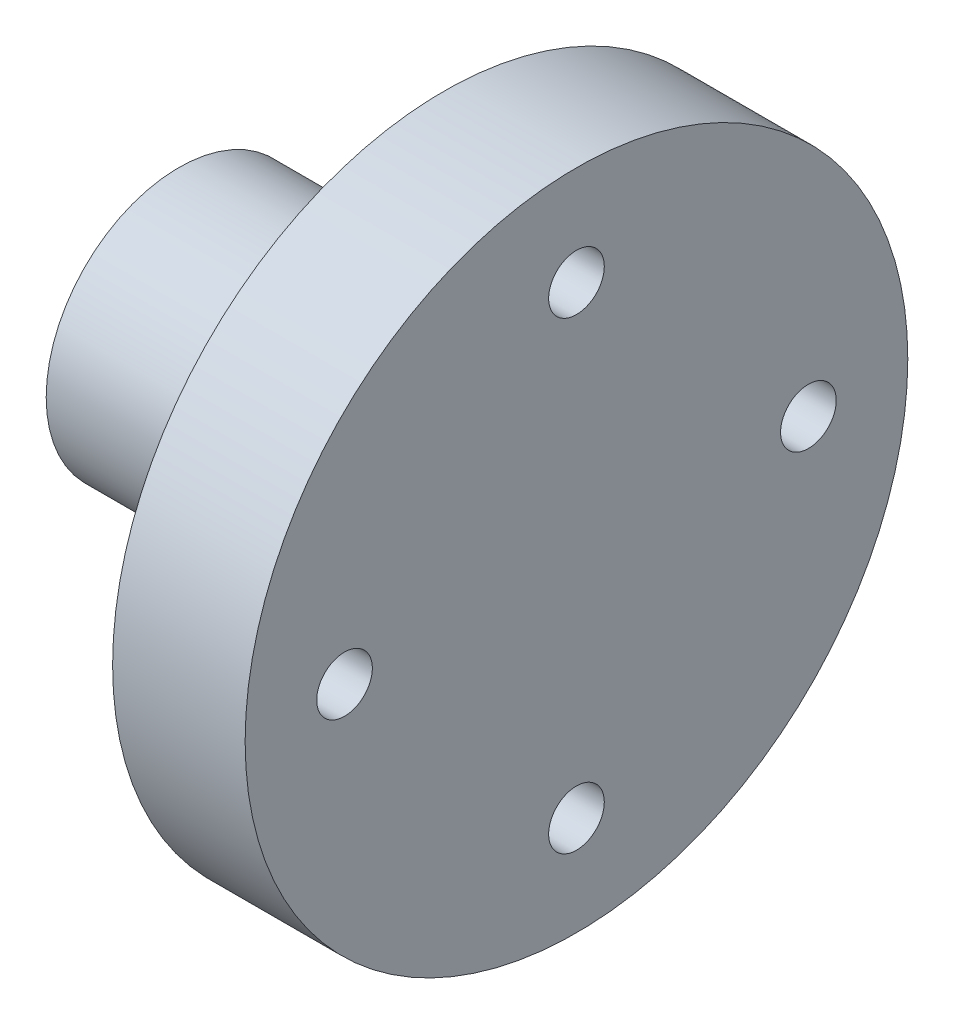
ISO-10303-21;
HEADER;
FILE_DESCRIPTION(('STEP AP214'),'2;1');
FILE_NAME('part.step','',(''),(''),'','','');
FILE_SCHEMA(('AUTOMOTIVE_DESIGN { 1 0 10303 214 1 1 1 1 }'));
ENDSEC;
DATA;
#1=APPLICATION_CONTEXT('core data for automotive mechanical design processes');
#2=APPLICATION_PROTOCOL_DEFINITION('international standard','automotive_design',2000,#1);
#3=PRODUCT_CONTEXT('',#1,'mechanical');
#4=PRODUCT('Part','Part','',(#3));
#5=PRODUCT_RELATED_PRODUCT_CATEGORY('part','',(#4));
#6=PRODUCT_DEFINITION_FORMATION('','',#4);
#7=PRODUCT_DEFINITION_CONTEXT('part definition',#1,'design');
#8=PRODUCT_DEFINITION('design','',#6,#7);
#9=PRODUCT_DEFINITION_SHAPE('','',#8);
#10=(LENGTH_UNIT() NAMED_UNIT(*) SI_UNIT(.MILLI.,.METRE.));
#11=(NAMED_UNIT(*) PLANE_ANGLE_UNIT() SI_UNIT($,.RADIAN.));
#12=(NAMED_UNIT(*) SI_UNIT($,.STERADIAN.) SOLID_ANGLE_UNIT());
#13=UNCERTAINTY_MEASURE_WITH_UNIT(LENGTH_MEASURE(1.E-05),#10,'distance_accuracy_value','');
#14=(GEOMETRIC_REPRESENTATION_CONTEXT(3) GLOBAL_UNCERTAINTY_ASSIGNED_CONTEXT((#13)) GLOBAL_UNIT_ASSIGNED_CONTEXT((#10,
#11,#12)) REPRESENTATION_CONTEXT('',''));
#15=CARTESIAN_POINT('',(0.,0.,0.));
#16=DIRECTION('',(0.,0.,1.));
#17=DIRECTION('',(1.,0.,0.));
#18=AXIS2_PLACEMENT_3D('',#15,#16,#17);
#19=CARTESIAN_POINT('',(26.693713360745,0.,0.));
#20=DIRECTION('',(1.,0.,0.));
#21=DIRECTION('',(0.,0.,-1.));
#22=AXIS2_PLACEMENT_3D('',#19,#20,#21);
#23=PLANE('',#22);
#24=DIRECTION('',(0.,-1.,0.));
#25=VECTOR('',#24,1.);
#26=CARTESIAN_POINT('',(26.693713360745,0.,1.5));
#27=LINE('',#26,#25);
#28=CARTESIAN_POINT('',(26.693713360745,6.43,1.5));
#29=VERTEX_POINT('',#28);
#30=CARTESIAN_POINT('',(26.693713360745,4.76969600708473,1.5));
#31=VERTEX_POINT('',#30);
#32=EDGE_CURVE('E92',#29,#31,#27,.T.);
#33=ORIENTED_EDGE('',*,*,#32,.T.);
#34=CARTESIAN_POINT('',(26.693713360745,0.,0.));
#35=DIRECTION('',(-1.,0.,0.));
#36=DIRECTION('',(0.,0.,1.));
#37=AXIS2_PLACEMENT_3D('',#34,#35,#36);
#38=CIRCLE('',#37,5.);
#39=CARTESIAN_POINT('',(26.693713360745,4.76969600708473,-1.5));
#40=VERTEX_POINT('',#39);
#41=EDGE_CURVE('E49',#40,#31,#38,.T.);
#42=ORIENTED_EDGE('',*,*,#41,.F.);
#43=DIRECTION('',(0.,-1.,0.));
#44=VECTOR('',#43,1.);
#45=CARTESIAN_POINT('',(26.693713360745,0.,-1.5));
#46=LINE('',#45,#44);
#47=CARTESIAN_POINT('',(26.693713360745,6.43,-1.5));
#48=VERTEX_POINT('',#47);
#49=EDGE_CURVE('E101',#48,#40,#46,.T.);
#50=ORIENTED_EDGE('',*,*,#49,.F.);
#51=DIRECTION('',(0.,0.,1.));
#52=VECTOR('',#51,1.);
#53=CARTESIAN_POINT('',(26.693713360745,6.43,0.));
#54=LINE('',#53,#52);
#55=EDGE_CURVE('E109',#48,#29,#54,.T.);
#56=ORIENTED_EDGE('',*,*,#55,.T.);
#57=EDGE_LOOP('',(#33,#42,#50,#56));
#58=FACE_BOUND('',#57,.T.);
#59=CARTESIAN_POINT('',(26.693713360745,0.,0.));
#60=DIRECTION('',(-1.,0.,0.));
#61=DIRECTION('',(0.,0.,1.));
#62=AXIS2_PLACEMENT_3D('',#59,#60,#61);
#63=CIRCLE('',#62,10.0105);
#64=CARTESIAN_POINT('',(26.693713360745,0.,10.0105));
#65=VERTEX_POINT('',#64);
#66=EDGE_CURVE('E11',#65,#65,#63,.T.);
#67=ORIENTED_EDGE('',*,*,#66,.T.);
#68=EDGE_LOOP('',(#67));
#69=FACE_BOUND('',#68,.T.);
#70=ADVANCED_FACE('F35',(#58,#69),#23,.F.);
#71=CARTESIAN_POINT('',(26.693713360745,0.,0.));
#72=DIRECTION('',(-1.,0.,0.));
#73=DIRECTION('',(0.,0.,1.));
#74=AXIS2_PLACEMENT_3D('',#71,#72,#73);
#75=CYLINDRICAL_SURFACE('',#74,10.0105);
#76=ORIENTED_EDGE('',*,*,#66,.F.);
#77=EDGE_LOOP('',(#76));
#78=FACE_BOUND('',#77,.T.);
#79=CARTESIAN_POINT('',(46.693713360745,0.,0.));
#80=DIRECTION('',(-1.,0.,0.));
#81=DIRECTION('',(0.,0.,1.));
#82=AXIS2_PLACEMENT_3D('',#79,#80,#81);
#83=CIRCLE('',#82,10.0105);
#84=CARTESIAN_POINT('',(46.693713360745,0.,10.0105));
#85=VERTEX_POINT('',#84);
#86=EDGE_CURVE('E42',#85,#85,#83,.T.);
#87=ORIENTED_EDGE('',*,*,#86,.T.);
#88=EDGE_LOOP('',(#87));
#89=FACE_BOUND('',#88,.T.);
#90=ADVANCED_FACE('F124',(#78,#89),#75,.T.);
#91=CARTESIAN_POINT('',(46.693713360745,0.,-10.0105));
#92=DIRECTION('',(1.,0.,0.));
#93=DIRECTION('',(0.,0.,-1.));
#94=AXIS2_PLACEMENT_3D('',#91,#92,#93);
#95=PLANE('',#94);
#96=CARTESIAN_POINT('',(46.6937133607451,17.5,0.));
#97=DIRECTION('',(1.,0.,0.));
#98=DIRECTION('',(0.,0.,-1.));
#99=AXIS2_PLACEMENT_3D('',#96,#97,#98);
#100=CIRCLE('',#99,2.1);
#101=CARTESIAN_POINT('',(46.6937133607451,17.5,-2.10000000000001));
#102=VERTEX_POINT('',#101);
#103=EDGE_CURVE('E107',#102,#102,#100,.T.);
#104=ORIENTED_EDGE('',*,*,#103,.T.);
#105=EDGE_LOOP('',(#104));
#106=FACE_BOUND('',#105,.T.);
#107=CARTESIAN_POINT('',(46.6937133607451,0.,-17.5));
#108=DIRECTION('',(1.,0.,0.));
#109=DIRECTION('',(0.,0.,-1.));
#110=AXIS2_PLACEMENT_3D('',#107,#108,#109);
#111=CIRCLE('',#110,2.1);
#112=CARTESIAN_POINT('',(46.6937133607451,0.,-19.6));
#113=VERTEX_POINT('',#112);
#114=EDGE_CURVE('E201',#113,#113,#111,.T.);
#115=ORIENTED_EDGE('',*,*,#114,.T.);
#116=EDGE_LOOP('',(#115));
#117=FACE_BOUND('',#116,.T.);
#118=CARTESIAN_POINT('',(46.6937133607451,-17.5,0.));
#119=DIRECTION('',(1.,0.,0.));
#120=DIRECTION('',(0.,0.,-1.));
#121=AXIS2_PLACEMENT_3D('',#118,#119,#120);
#122=CIRCLE('',#121,2.1);
#123=CARTESIAN_POINT('',(46.6937133607451,-17.5,-2.10000000000001));
#124=VERTEX_POINT('',#123);
#125=EDGE_CURVE('E210',#124,#124,#122,.T.);
#126=ORIENTED_EDGE('',*,*,#125,.T.);
#127=EDGE_LOOP('',(#126));
#128=FACE_BOUND('',#127,.T.);
#129=CARTESIAN_POINT('',(46.693713360745,0.,17.5));
#130=DIRECTION('',(1.,0.,0.));
#131=DIRECTION('',(0.,0.,-1.));
#132=AXIS2_PLACEMENT_3D('',#129,#130,#131);
#133=CIRCLE('',#132,2.1);
#134=CARTESIAN_POINT('',(46.693713360745,0.,15.4));
#135=VERTEX_POINT('',#134);
#136=EDGE_CURVE('E216',#135,#135,#133,.T.);
#137=ORIENTED_EDGE('',*,*,#136,.T.);
#138=EDGE_LOOP('',(#137));
#139=FACE_BOUND('',#138,.T.);
#140=ORIENTED_EDGE('',*,*,#86,.F.);
#141=EDGE_LOOP('',(#140));
#142=FACE_BOUND('',#141,.T.);
#143=CARTESIAN_POINT('',(46.6937133607451,0.,0.));
#144=DIRECTION('',(-1.,0.,0.));
#145=DIRECTION('',(0.,0.,1.));
#146=AXIS2_PLACEMENT_3D('',#143,#144,#145);
#147=CIRCLE('',#146,25.);
#148=CARTESIAN_POINT('',(46.6937133607451,0.,25.));
#149=VERTEX_POINT('',#148);
#150=EDGE_CURVE('E119',#149,#149,#147,.T.);
#151=ORIENTED_EDGE('',*,*,#150,.T.);
#152=EDGE_LOOP('',(#151));
#153=FACE_BOUND('',#152,.T.);
#154=ADVANCED_FACE('F126',(#106,#117,#128,#139,#142,#153),#95,.F.);
#155=CARTESIAN_POINT('',(26.693713360745,0.,0.));
#156=DIRECTION('',(-1.,0.,0.));
#157=DIRECTION('',(0.,0.,1.));
#158=AXIS2_PLACEMENT_3D('',#155,#156,#157);
#159=CYLINDRICAL_SURFACE('',#158,25.);
#160=ORIENTED_EDGE('',*,*,#150,.F.);
#161=EDGE_LOOP('',(#160));
#162=FACE_BOUND('',#161,.T.);
#163=CARTESIAN_POINT('',(56.6937133607451,0.,0.));
#164=DIRECTION('',(-1.,0.,0.));
#165=DIRECTION('',(0.,0.,1.));
#166=AXIS2_PLACEMENT_3D('',#163,#164,#165);
#167=CIRCLE('',#166,25.);
#168=CARTESIAN_POINT('',(56.6937133607451,0.,25.));
#169=VERTEX_POINT('',#168);
#170=EDGE_CURVE('E113',#169,#169,#167,.T.);
#171=ORIENTED_EDGE('',*,*,#170,.T.);
#172=EDGE_LOOP('',(#171));
#173=FACE_BOUND('',#172,.T.);
#174=ADVANCED_FACE('F129',(#162,#173),#159,.T.);
#175=CARTESIAN_POINT('',(56.6937133607451,0.,-25.));
#176=DIRECTION('',(-1.,0.,0.));
#177=DIRECTION('',(0.,0.,1.));
#178=AXIS2_PLACEMENT_3D('',#175,#176,#177);
#179=PLANE('',#178);
#180=CARTESIAN_POINT('',(56.6937133607451,17.5,0.));
#181=DIRECTION('',(1.,0.,0.));
#182=DIRECTION('',(0.,0.,-1.));
#183=AXIS2_PLACEMENT_3D('',#180,#181,#182);
#184=CIRCLE('',#183,2.1);
#185=CARTESIAN_POINT('',(56.6937133607451,17.5,-2.1));
#186=VERTEX_POINT('',#185);
#187=EDGE_CURVE('E200',#186,#186,#184,.T.);
#188=ORIENTED_EDGE('',*,*,#187,.F.);
#189=EDGE_LOOP('',(#188));
#190=FACE_BOUND('',#189,.T.);
#191=CARTESIAN_POINT('',(56.6937133607451,0.,-17.5));
#192=DIRECTION('',(1.,0.,0.));
#193=DIRECTION('',(0.,0.,-1.));
#194=AXIS2_PLACEMENT_3D('',#191,#192,#193);
#195=CIRCLE('',#194,2.1);
#196=CARTESIAN_POINT('',(56.6937133607451,0.,-19.6));
#197=VERTEX_POINT('',#196);
#198=EDGE_CURVE('E205',#197,#197,#195,.T.);
#199=ORIENTED_EDGE('',*,*,#198,.F.);
#200=EDGE_LOOP('',(#199));
#201=FACE_BOUND('',#200,.T.);
#202=CARTESIAN_POINT('',(56.6937133607451,-17.5,0.));
#203=DIRECTION('',(1.,0.,0.));
#204=DIRECTION('',(0.,0.,-1.));
#205=AXIS2_PLACEMENT_3D('',#202,#203,#204);
#206=CIRCLE('',#205,2.1);
#207=CARTESIAN_POINT('',(56.6937133607451,-17.5,-2.1));
#208=VERTEX_POINT('',#207);
#209=EDGE_CURVE('E213',#208,#208,#206,.T.);
#210=ORIENTED_EDGE('',*,*,#209,.F.);
#211=EDGE_LOOP('',(#210));
#212=FACE_BOUND('',#211,.T.);
#213=CARTESIAN_POINT('',(56.693713360745,0.,17.5));
#214=DIRECTION('',(1.,0.,0.));
#215=DIRECTION('',(0.,0.,-1.));
#216=AXIS2_PLACEMENT_3D('',#213,#214,#215);
#217=CIRCLE('',#216,2.1);
#218=CARTESIAN_POINT('',(56.693713360745,0.,15.4));
#219=VERTEX_POINT('',#218);
#220=EDGE_CURVE('E218',#219,#219,#217,.T.);
#221=ORIENTED_EDGE('',*,*,#220,.F.);
#222=EDGE_LOOP('',(#221));
#223=FACE_BOUND('',#222,.T.);
#224=ORIENTED_EDGE('',*,*,#170,.F.);
#225=EDGE_LOOP('',(#224));
#226=FACE_BOUND('',#225,.T.);
#227=ADVANCED_FACE('F136',(#190,#201,#212,#223,#226),#179,.F.);
#228=CARTESIAN_POINT('',(46.693713360745,0.,0.));
#229=DIRECTION('',(-1.,0.,0.));
#230=DIRECTION('',(0.,0.,1.));
#231=AXIS2_PLACEMENT_3D('',#228,#229,#230);
#232=CYLINDRICAL_SURFACE('',#231,5.);
#233=ORIENTED_EDGE('',*,*,#41,.T.);
#234=DIRECTION('',(-1.,0.,0.));
#235=VECTOR('',#234,1.);
#236=CARTESIAN_POINT('',(46.693713360745,4.76969600708473,1.5));
#237=LINE('',#236,#235);
#238=CARTESIAN_POINT('',(46.693713360745,4.76969600708473,1.5));
#239=VERTEX_POINT('',#238);
#240=EDGE_CURVE('E95',#239,#31,#237,.T.);
#241=ORIENTED_EDGE('',*,*,#240,.F.);
#242=CARTESIAN_POINT('',(46.693713360745,0.,0.));
#243=DIRECTION('',(-1.,0.,0.));
#244=DIRECTION('',(0.,0.,1.));
#245=AXIS2_PLACEMENT_3D('',#242,#243,#244);
#246=CIRCLE('',#245,5.);
#247=CARTESIAN_POINT('',(46.693713360745,4.76969600708473,-1.5));
#248=VERTEX_POINT('',#247);
#249=EDGE_CURVE('E99',#248,#239,#246,.T.);
#250=ORIENTED_EDGE('',*,*,#249,.F.);
#251=DIRECTION('',(-1.,0.,0.));
#252=VECTOR('',#251,1.);
#253=CARTESIAN_POINT('',(46.693713360745,4.76969600708473,-1.5));
#254=LINE('',#253,#252);
#255=EDGE_CURVE('E57',#248,#40,#254,.T.);
#256=ORIENTED_EDGE('',*,*,#255,.T.);
#257=EDGE_LOOP('',(#233,#241,#250,#256));
#258=FACE_BOUND('',#257,.T.);
#259=ADVANCED_FACE('F141',(#258),#232,.F.);
#260=CARTESIAN_POINT('',(46.693713360745,0.,-1.5));
#261=DIRECTION('',(0.,0.,-1.));
#262=DIRECTION('',(0.,1.,0.));
#263=AXIS2_PLACEMENT_3D('',#260,#261,#262);
#264=PLANE('',#263);
#265=ORIENTED_EDGE('',*,*,#49,.T.);
#266=ORIENTED_EDGE('',*,*,#255,.F.);
#267=DIRECTION('',(0.,-1.,0.));
#268=VECTOR('',#267,1.);
#269=CARTESIAN_POINT('',(46.693713360745,0.,-1.5));
#270=LINE('',#269,#268);
#271=CARTESIAN_POINT('',(46.693713360745,6.43,-1.5));
#272=VERTEX_POINT('',#271);
#273=EDGE_CURVE('E88',#272,#248,#270,.T.);
#274=ORIENTED_EDGE('',*,*,#273,.F.);
#275=DIRECTION('',(-1.,0.,0.));
#276=VECTOR('',#275,1.);
#277=CARTESIAN_POINT('',(46.693713360745,6.43,-1.5));
#278=LINE('',#277,#276);
#279=EDGE_CURVE('E85',#272,#48,#278,.T.);
#280=ORIENTED_EDGE('',*,*,#279,.T.);
#281=EDGE_LOOP('',(#265,#266,#274,#280));
#282=FACE_BOUND('',#281,.T.);
#283=ADVANCED_FACE('F147',(#282),#264,.F.);
#284=CARTESIAN_POINT('',(46.693713360745,6.43,0.));
#285=DIRECTION('',(0.,-1.,0.));
#286=DIRECTION('',(0.,0.,-1.));
#287=AXIS2_PLACEMENT_3D('',#284,#285,#286);
#288=PLANE('',#287);
#289=ORIENTED_EDGE('',*,*,#55,.F.);
#290=ORIENTED_EDGE('',*,*,#279,.F.);
#291=DIRECTION('',(0.,0.,1.));
#292=VECTOR('',#291,1.);
#293=CARTESIAN_POINT('',(46.693713360745,6.43,0.));
#294=LINE('',#293,#292);
#295=CARTESIAN_POINT('',(46.693713360745,6.43,1.5));
#296=VERTEX_POINT('',#295);
#297=EDGE_CURVE('E80',#272,#296,#294,.T.);
#298=ORIENTED_EDGE('',*,*,#297,.T.);
#299=DIRECTION('',(-1.,0.,0.));
#300=VECTOR('',#299,1.);
#301=CARTESIAN_POINT('',(46.693713360745,6.43,1.5));
#302=LINE('',#301,#300);
#303=EDGE_CURVE('E83',#296,#29,#302,.T.);
#304=ORIENTED_EDGE('',*,*,#303,.T.);
#305=EDGE_LOOP('',(#289,#290,#298,#304));
#306=FACE_BOUND('',#305,.T.);
#307=ADVANCED_FACE('F82',(#306),#288,.T.);
#308=CARTESIAN_POINT('',(46.693713360745,0.,1.5));
#309=DIRECTION('',(0.,0.,-1.));
#310=DIRECTION('',(0.,1.,0.));
#311=AXIS2_PLACEMENT_3D('',#308,#309,#310);
#312=PLANE('',#311);
#313=ORIENTED_EDGE('',*,*,#32,.F.);
#314=ORIENTED_EDGE('',*,*,#303,.F.);
#315=DIRECTION('',(0.,-1.,0.));
#316=VECTOR('',#315,1.);
#317=CARTESIAN_POINT('',(46.693713360745,0.,1.5));
#318=LINE('',#317,#316);
#319=EDGE_CURVE('E76',#296,#239,#318,.T.);
#320=ORIENTED_EDGE('',*,*,#319,.T.);
#321=ORIENTED_EDGE('',*,*,#240,.T.);
#322=EDGE_LOOP('',(#313,#314,#320,#321));
#323=FACE_BOUND('',#322,.T.);
#324=ADVANCED_FACE('F90',(#323),#312,.T.);
#325=CARTESIAN_POINT('',(46.693713360745,0.,0.));
#326=DIRECTION('',(-1.,0.,0.));
#327=DIRECTION('',(0.,0.,1.));
#328=AXIS2_PLACEMENT_3D('',#325,#326,#327);
#329=PLANE('',#328);
#330=ORIENTED_EDGE('',*,*,#249,.T.);
#331=ORIENTED_EDGE('',*,*,#319,.F.);
#332=ORIENTED_EDGE('',*,*,#297,.F.);
#333=ORIENTED_EDGE('',*,*,#273,.T.);
#334=EDGE_LOOP('',(#330,#331,#332,#333));
#335=FACE_BOUND('',#334,.T.);
#336=ADVANCED_FACE('F98',(#335),#329,.T.);
#337=CARTESIAN_POINT('',(46.693713360745,0.,17.5));
#338=DIRECTION('',(1.,0.,0.));
#339=DIRECTION('',(0.,0.,-1.));
#340=AXIS2_PLACEMENT_3D('',#337,#338,#339);
#341=CYLINDRICAL_SURFACE('',#340,2.1);
#342=ORIENTED_EDGE('',*,*,#136,.F.);
#343=EDGE_LOOP('',(#342));
#344=FACE_BOUND('',#343,.T.);
#345=ORIENTED_EDGE('',*,*,#220,.T.);
#346=EDGE_LOOP('',(#345));
#347=FACE_BOUND('',#346,.T.);
#348=ADVANCED_FACE('F173',(#344,#347),#341,.F.);
#349=CARTESIAN_POINT('',(46.6937133607451,-17.5,0.));
#350=DIRECTION('',(1.,0.,0.));
#351=DIRECTION('',(0.,0.,-1.));
#352=AXIS2_PLACEMENT_3D('',#349,#350,#351);
#353=CYLINDRICAL_SURFACE('',#352,2.1);
#354=ORIENTED_EDGE('',*,*,#125,.F.);
#355=EDGE_LOOP('',(#354));
#356=FACE_BOUND('',#355,.T.);
#357=ORIENTED_EDGE('',*,*,#209,.T.);
#358=EDGE_LOOP('',(#357));
#359=FACE_BOUND('',#358,.T.);
#360=ADVANCED_FACE('F177',(#356,#359),#353,.F.);
#361=CARTESIAN_POINT('',(46.6937133607451,0.,-17.5));
#362=DIRECTION('',(1.,0.,0.));
#363=DIRECTION('',(0.,0.,-1.));
#364=AXIS2_PLACEMENT_3D('',#361,#362,#363);
#365=CYLINDRICAL_SURFACE('',#364,2.1);
#366=ORIENTED_EDGE('',*,*,#114,.F.);
#367=EDGE_LOOP('',(#366));
#368=FACE_BOUND('',#367,.T.);
#369=ORIENTED_EDGE('',*,*,#198,.T.);
#370=EDGE_LOOP('',(#369));
#371=FACE_BOUND('',#370,.T.);
#372=ADVANCED_FACE('F182',(#368,#371),#365,.F.);
#373=CARTESIAN_POINT('',(46.6937133607451,17.5,0.));
#374=DIRECTION('',(1.,0.,0.));
#375=DIRECTION('',(0.,0.,-1.));
#376=AXIS2_PLACEMENT_3D('',#373,#374,#375);
#377=CYLINDRICAL_SURFACE('',#376,2.1);
#378=ORIENTED_EDGE('',*,*,#103,.F.);
#379=EDGE_LOOP('',(#378));
#380=FACE_BOUND('',#379,.T.);
#381=ORIENTED_EDGE('',*,*,#187,.T.);
#382=EDGE_LOOP('',(#381));
#383=FACE_BOUND('',#382,.T.);
#384=ADVANCED_FACE('F190',(#380,#383),#377,.F.);
#385=CLOSED_SHELL('',(#70,#90,#154,#174,#227,#259,#283,#307,#324,#336,#348,#360,#372,#384));
#386=MANIFOLD_SOLID_BREP('B2',#385);
#387=ADVANCED_BREP_SHAPE_REPRESENTATION('',(#18,#386),#14);
#388=SHAPE_DEFINITION_REPRESENTATION(#9,#387);
ENDSEC;
END-ISO-10303-21;
